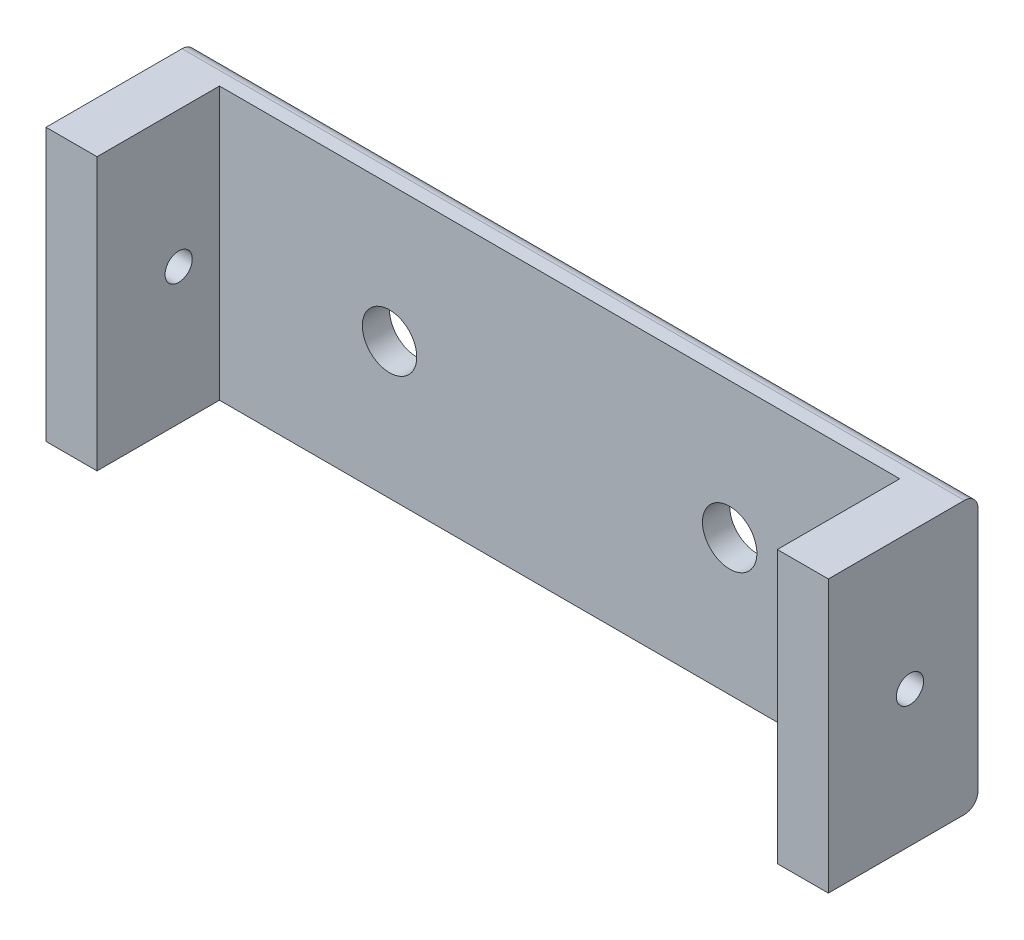
ISO-10303-21;
HEADER;
FILE_DESCRIPTION(('STEP AP214'),'2;1');
FILE_NAME('part.step','',(''),(''),'','','');
FILE_SCHEMA(('AUTOMOTIVE_DESIGN { 1 0 10303 214 1 1 1 1 }'));
ENDSEC;
DATA;
#1=APPLICATION_CONTEXT('core data for automotive mechanical design processes');
#2=APPLICATION_PROTOCOL_DEFINITION('international standard','automotive_design',2000,#1);
#3=PRODUCT_CONTEXT('',#1,'mechanical');
#4=PRODUCT('Part','Part','',(#3));
#5=PRODUCT_RELATED_PRODUCT_CATEGORY('part','',(#4));
#6=PRODUCT_DEFINITION_FORMATION('','',#4);
#7=PRODUCT_DEFINITION_CONTEXT('part definition',#1,'design');
#8=PRODUCT_DEFINITION('design','',#6,#7);
#9=PRODUCT_DEFINITION_SHAPE('','',#8);
#10=(LENGTH_UNIT() NAMED_UNIT(*) SI_UNIT(.MILLI.,.METRE.));
#11=(NAMED_UNIT(*) PLANE_ANGLE_UNIT() SI_UNIT($,.RADIAN.));
#12=(NAMED_UNIT(*) SI_UNIT($,.STERADIAN.) SOLID_ANGLE_UNIT());
#13=UNCERTAINTY_MEASURE_WITH_UNIT(LENGTH_MEASURE(1.E-05),#10,'distance_accuracy_value','');
#14=(GEOMETRIC_REPRESENTATION_CONTEXT(3) GLOBAL_UNCERTAINTY_ASSIGNED_CONTEXT((#13)) GLOBAL_UNIT_ASSIGNED_CONTEXT((#10,
#11,#12)) REPRESENTATION_CONTEXT('',''));
#15=CARTESIAN_POINT('',(0.,0.,0.));
#16=DIRECTION('',(0.,0.,1.));
#17=DIRECTION('',(1.,0.,0.));
#18=AXIS2_PLACEMENT_3D('',#15,#16,#17);
#19=CARTESIAN_POINT('',(57.5,-20.,25.));
#20=DIRECTION('',(-1.,0.,0.));
#21=DIRECTION('',(0.,0.,1.));
#22=AXIS2_PLACEMENT_3D('',#19,#20,#21);
#23=PLANE('',#22);
#24=CARTESIAN_POINT('',(57.5,-8.10915094297487E-13,10.));
#25=DIRECTION('',(-1.,0.,0.));
#26=DIRECTION('',(0.,0.,1.));
#27=AXIS2_PLACEMENT_3D('',#24,#25,#26);
#28=CIRCLE('',#27,2.);
#29=CARTESIAN_POINT('',(57.5,-8.10915094297487E-13,12.));
#30=VERTEX_POINT('',#29);
#31=EDGE_CURVE('E206',#30,#30,#28,.T.);
#32=ORIENTED_EDGE('',*,*,#31,.T.);
#33=EDGE_LOOP('',(#32));
#34=FACE_BOUND('',#33,.T.);
#35=DIRECTION('',(0.,1.,0.));
#36=VECTOR('',#35,1.);
#37=CARTESIAN_POINT('',(57.5,20.,22.));
#38=LINE('',#37,#36);
#39=CARTESIAN_POINT('',(57.5,-20.,22.));
#40=VERTEX_POINT('',#39);
#41=CARTESIAN_POINT('',(57.5,20.,22.));
#42=VERTEX_POINT('',#41);
#43=EDGE_CURVE('E133',#40,#42,#38,.T.);
#44=ORIENTED_EDGE('',*,*,#43,.F.);
#45=DIRECTION('',(0.,0.,-1.));
#46=VECTOR('',#45,1.);
#47=CARTESIAN_POINT('',(57.5,-20.,25.));
#48=LINE('',#47,#46);
#49=CARTESIAN_POINT('',(57.5,-20.,2.));
#50=VERTEX_POINT('',#49);
#51=EDGE_CURVE('E136',#40,#50,#48,.T.);
#52=ORIENTED_EDGE('',*,*,#51,.T.);
#53=CARTESIAN_POINT('',(57.5,-18.,2.));
#54=DIRECTION('',(-1.,0.,0.));
#55=DIRECTION('',(0.,0.,1.));
#56=AXIS2_PLACEMENT_3D('',#53,#54,#55);
#57=CIRCLE('',#56,2.);
#58=CARTESIAN_POINT('',(57.5,-18.,0.));
#59=VERTEX_POINT('',#58);
#60=EDGE_CURVE('E170',#50,#59,#57,.F.);
#61=ORIENTED_EDGE('',*,*,#60,.T.);
#62=DIRECTION('',(0.,1.,0.));
#63=VECTOR('',#62,1.);
#64=CARTESIAN_POINT('',(57.5,-20.,0.));
#65=LINE('',#64,#63);
#66=CARTESIAN_POINT('',(57.5,18.,0.));
#67=VERTEX_POINT('',#66);
#68=EDGE_CURVE('E176',#59,#67,#65,.T.);
#69=ORIENTED_EDGE('',*,*,#68,.T.);
#70=CARTESIAN_POINT('',(57.5,18.,2.));
#71=DIRECTION('',(-1.,0.,0.));
#72=DIRECTION('',(0.,0.,1.));
#73=AXIS2_PLACEMENT_3D('',#70,#71,#72);
#74=CIRCLE('',#73,2.);
#75=CARTESIAN_POINT('',(57.5,20.,2.));
#76=VERTEX_POINT('',#75);
#77=EDGE_CURVE('E162',#67,#76,#74,.F.);
#78=ORIENTED_EDGE('',*,*,#77,.T.);
#79=DIRECTION('',(0.,0.,-1.));
#80=VECTOR('',#79,1.);
#81=CARTESIAN_POINT('',(57.5,20.,25.));
#82=LINE('',#81,#80);
#83=EDGE_CURVE('E145',#42,#76,#82,.T.);
#84=ORIENTED_EDGE('',*,*,#83,.F.);
#85=EDGE_LOOP('',(#44,#52,#61,#69,#78,#84));
#86=FACE_BOUND('',#85,.T.);
#87=ADVANCED_FACE('F41',(#34,#86),#23,.F.);
#88=CARTESIAN_POINT('',(-57.5,-20.,25.));
#89=DIRECTION('',(1.,0.,0.));
#90=DIRECTION('',(0.,0.,-1.));
#91=AXIS2_PLACEMENT_3D('',#88,#89,#90);
#92=PLANE('',#91);
#93=CARTESIAN_POINT('',(-57.5000000000001,0.,10.));
#94=DIRECTION('',(-1.,0.,0.));
#95=DIRECTION('',(0.,-1.,0.));
#96=AXIS2_PLACEMENT_3D('',#93,#94,#95);
#97=CIRCLE('',#96,2.);
#98=CARTESIAN_POINT('',(-57.5000000000001,-2.00000000000001,10.));
#99=VERTEX_POINT('',#98);
#100=EDGE_CURVE('E154',#99,#99,#97,.T.);
#101=ORIENTED_EDGE('',*,*,#100,.F.);
#102=EDGE_LOOP('',(#101));
#103=FACE_BOUND('',#102,.T.);
#104=DIRECTION('',(0.,-1.,0.));
#105=VECTOR('',#104,1.);
#106=CARTESIAN_POINT('',(-57.5,20.,22.));
#107=LINE('',#106,#105);
#108=CARTESIAN_POINT('',(-57.5,20.,22.));
#109=VERTEX_POINT('',#108);
#110=CARTESIAN_POINT('',(-57.5,-20.,22.));
#111=VERTEX_POINT('',#110);
#112=EDGE_CURVE('E114',#109,#111,#107,.T.);
#113=ORIENTED_EDGE('',*,*,#112,.F.);
#114=DIRECTION('',(0.,0.,-1.));
#115=VECTOR('',#114,1.);
#116=CARTESIAN_POINT('',(-57.5,20.,25.));
#117=LINE('',#116,#115);
#118=CARTESIAN_POINT('',(-57.5,20.,2.));
#119=VERTEX_POINT('',#118);
#120=EDGE_CURVE('E139',#109,#119,#117,.T.);
#121=ORIENTED_EDGE('',*,*,#120,.T.);
#122=CARTESIAN_POINT('',(-57.5,18.,2.));
#123=DIRECTION('',(1.,0.,0.));
#124=DIRECTION('',(0.,0.,-1.));
#125=AXIS2_PLACEMENT_3D('',#122,#123,#124);
#126=CIRCLE('',#125,2.);
#127=CARTESIAN_POINT('',(-57.5,18.,0.));
#128=VERTEX_POINT('',#127);
#129=EDGE_CURVE('E160',#119,#128,#126,.F.);
#130=ORIENTED_EDGE('',*,*,#129,.T.);
#131=DIRECTION('',(0.,-1.,0.));
#132=VECTOR('',#131,1.);
#133=CARTESIAN_POINT('',(-57.5,-20.,0.));
#134=LINE('',#133,#132);
#135=CARTESIAN_POINT('',(-57.5,-18.,0.));
#136=VERTEX_POINT('',#135);
#137=EDGE_CURVE('E144',#128,#136,#134,.T.);
#138=ORIENTED_EDGE('',*,*,#137,.T.);
#139=CARTESIAN_POINT('',(-57.5,-18.,2.));
#140=DIRECTION('',(1.,0.,0.));
#141=DIRECTION('',(0.,0.,-1.));
#142=AXIS2_PLACEMENT_3D('',#139,#140,#141);
#143=CIRCLE('',#142,2.);
#144=CARTESIAN_POINT('',(-57.5,-20.,2.));
#145=VERTEX_POINT('',#144);
#146=EDGE_CURVE('E47',#136,#145,#143,.F.);
#147=ORIENTED_EDGE('',*,*,#146,.T.);
#148=DIRECTION('',(0.,0.,-1.));
#149=VECTOR('',#148,1.);
#150=CARTESIAN_POINT('',(-57.5,-20.,25.));
#151=LINE('',#150,#149);
#152=EDGE_CURVE('E129',#111,#145,#151,.T.);
#153=ORIENTED_EDGE('',*,*,#152,.F.);
#154=EDGE_LOOP('',(#113,#121,#130,#138,#147,#153));
#155=FACE_BOUND('',#154,.T.);
#156=ADVANCED_FACE('F131',(#103,#155),#92,.F.);
#157=CARTESIAN_POINT('',(-57.5,20.,25.));
#158=DIRECTION('',(0.,-1.,0.));
#159=DIRECTION('',(0.,0.,-1.));
#160=AXIS2_PLACEMENT_3D('',#157,#158,#159);
#161=PLANE('',#160);
#162=DIRECTION('',(-1.,0.,0.));
#163=VECTOR('',#162,1.);
#164=CARTESIAN_POINT('',(-57.5,20.,22.));
#165=LINE('',#164,#163);
#166=CARTESIAN_POINT('',(50.,20.,22.));
#167=VERTEX_POINT('',#166);
#168=EDGE_CURVE('E57',#42,#167,#165,.T.);
#169=ORIENTED_EDGE('',*,*,#168,.F.);
#170=ORIENTED_EDGE('',*,*,#83,.T.);
#171=DIRECTION('',(-1.,0.,0.));
#172=VECTOR('',#171,1.);
#173=CARTESIAN_POINT('',(-57.5,20.,2.));
#174=LINE('',#173,#172);
#175=EDGE_CURVE('E146',#76,#119,#174,.T.);
#176=ORIENTED_EDGE('',*,*,#175,.T.);
#177=ORIENTED_EDGE('',*,*,#120,.F.);
#178=CARTESIAN_POINT('',(-50.,20.,22.));
#179=VERTEX_POINT('',#178);
#180=EDGE_CURVE('E117',#179,#109,#165,.T.);
#181=ORIENTED_EDGE('',*,*,#180,.F.);
#182=DIRECTION('',(0.,0.,1.));
#183=VECTOR('',#182,1.);
#184=CARTESIAN_POINT('',(-50.,20.,3.99999999999997));
#185=LINE('',#184,#183);
#186=CARTESIAN_POINT('',(-50.,20.,3.99999999999997));
#187=VERTEX_POINT('',#186);
#188=EDGE_CURVE('E228',#187,#179,#185,.T.);
#189=ORIENTED_EDGE('',*,*,#188,.F.);
#190=DIRECTION('',(-1.,0.,0.));
#191=VECTOR('',#190,1.);
#192=CARTESIAN_POINT('',(-50.,20.,3.99999999999997));
#193=LINE('',#192,#191);
#194=CARTESIAN_POINT('',(50.,20.,3.99999999999997));
#195=VERTEX_POINT('',#194);
#196=EDGE_CURVE('E211',#195,#187,#193,.T.);
#197=ORIENTED_EDGE('',*,*,#196,.F.);
#198=DIRECTION('',(0.,0.,1.));
#199=VECTOR('',#198,1.);
#200=CARTESIAN_POINT('',(50.,20.,3.99999999999997));
#201=LINE('',#200,#199);
#202=EDGE_CURVE('E225',#195,#167,#201,.T.);
#203=ORIENTED_EDGE('',*,*,#202,.T.);
#204=EDGE_LOOP('',(#169,#170,#176,#177,#181,#189,#197,#203));
#205=FACE_BOUND('',#204,.T.);
#206=ADVANCED_FACE('F236',(#205),#161,.F.);
#207=CARTESIAN_POINT('',(-57.5,-20.,25.));
#208=DIRECTION('',(0.,1.,0.));
#209=DIRECTION('',(0.,0.,1.));
#210=AXIS2_PLACEMENT_3D('',#207,#208,#209);
#211=PLANE('',#210);
#212=DIRECTION('',(1.,0.,0.));
#213=VECTOR('',#212,1.);
#214=CARTESIAN_POINT('',(-57.5,-20.,22.));
#215=LINE('',#214,#213);
#216=CARTESIAN_POINT('',(-50.,-20.,22.));
#217=VERTEX_POINT('',#216);
#218=EDGE_CURVE('E64',#111,#217,#215,.T.);
#219=ORIENTED_EDGE('',*,*,#218,.F.);
#220=ORIENTED_EDGE('',*,*,#152,.T.);
#221=DIRECTION('',(1.,0.,0.));
#222=VECTOR('',#221,1.);
#223=CARTESIAN_POINT('',(57.5,-20.,2.));
#224=LINE('',#223,#222);
#225=EDGE_CURVE('E164',#145,#50,#224,.T.);
#226=ORIENTED_EDGE('',*,*,#225,.T.);
#227=ORIENTED_EDGE('',*,*,#51,.F.);
#228=CARTESIAN_POINT('',(50.,-20.,22.));
#229=VERTEX_POINT('',#228);
#230=EDGE_CURVE('E125',#229,#40,#215,.T.);
#231=ORIENTED_EDGE('',*,*,#230,.F.);
#232=DIRECTION('',(0.,0.,1.));
#233=VECTOR('',#232,1.);
#234=CARTESIAN_POINT('',(50.,-20.,3.99999999999997));
#235=LINE('',#234,#233);
#236=CARTESIAN_POINT('',(50.,-20.,3.99999999999997));
#237=VERTEX_POINT('',#236);
#238=EDGE_CURVE('E223',#237,#229,#235,.T.);
#239=ORIENTED_EDGE('',*,*,#238,.F.);
#240=DIRECTION('',(1.,0.,0.));
#241=VECTOR('',#240,1.);
#242=CARTESIAN_POINT('',(-50.,-20.,3.99999999999997));
#243=LINE('',#242,#241);
#244=CARTESIAN_POINT('',(-50.,-20.,3.99999999999997));
#245=VERTEX_POINT('',#244);
#246=EDGE_CURVE('E219',#245,#237,#243,.T.);
#247=ORIENTED_EDGE('',*,*,#246,.F.);
#248=DIRECTION('',(0.,0.,1.));
#249=VECTOR('',#248,1.);
#250=CARTESIAN_POINT('',(-50.,-20.,3.99999999999997));
#251=LINE('',#250,#249);
#252=EDGE_CURVE('E135',#245,#217,#251,.T.);
#253=ORIENTED_EDGE('',*,*,#252,.T.);
#254=EDGE_LOOP('',(#219,#220,#226,#227,#231,#239,#247,#253));
#255=FACE_BOUND('',#254,.T.);
#256=ADVANCED_FACE('F127',(#255),#211,.F.);
#257=CARTESIAN_POINT('',(50.,-20.,3.99999999999997));
#258=DIRECTION('',(1.,0.,0.));
#259=DIRECTION('',(0.,0.,-1.));
#260=AXIS2_PLACEMENT_3D('',#257,#258,#259);
#261=PLANE('',#260);
#262=CARTESIAN_POINT('',(50.,-7.5854287421484E-13,10.));
#263=DIRECTION('',(1.,0.,0.));
#264=DIRECTION('',(0.,0.,-1.));
#265=AXIS2_PLACEMENT_3D('',#262,#263,#264);
#266=CIRCLE('',#265,2.);
#267=CARTESIAN_POINT('',(50.,-7.5854287421484E-13,8.));
#268=VERTEX_POINT('',#267);
#269=EDGE_CURVE('E153',#268,#268,#266,.T.);
#270=ORIENTED_EDGE('',*,*,#269,.T.);
#271=EDGE_LOOP('',(#270));
#272=FACE_BOUND('',#271,.T.);
#273=DIRECTION('',(0.,-1.,0.));
#274=VECTOR('',#273,1.);
#275=CARTESIAN_POINT('',(50.,-20.,22.));
#276=LINE('',#275,#274);
#277=EDGE_CURVE('E188',#167,#229,#276,.T.);
#278=ORIENTED_EDGE('',*,*,#277,.F.);
#279=ORIENTED_EDGE('',*,*,#202,.F.);
#280=DIRECTION('',(0.,1.,0.));
#281=VECTOR('',#280,1.);
#282=CARTESIAN_POINT('',(50.,-20.,3.99999999999997));
#283=LINE('',#282,#281);
#284=EDGE_CURVE('E212',#237,#195,#283,.T.);
#285=ORIENTED_EDGE('',*,*,#284,.F.);
#286=ORIENTED_EDGE('',*,*,#238,.T.);
#287=EDGE_LOOP('',(#278,#279,#285,#286));
#288=FACE_BOUND('',#287,.T.);
#289=ADVANCED_FACE('F239',(#272,#288),#261,.F.);
#290=CARTESIAN_POINT('',(-50.,-20.,3.99999999999997));
#291=DIRECTION('',(-1.,0.,0.));
#292=DIRECTION('',(0.,0.,1.));
#293=AXIS2_PLACEMENT_3D('',#290,#291,#292);
#294=PLANE('',#293);
#295=CARTESIAN_POINT('',(-50.,0.,10.));
#296=DIRECTION('',(-1.,0.,0.));
#297=DIRECTION('',(0.,0.,1.));
#298=AXIS2_PLACEMENT_3D('',#295,#296,#297);
#299=CIRCLE('',#298,2.);
#300=CARTESIAN_POINT('',(-50.,0.,12.));
#301=VERTEX_POINT('',#300);
#302=EDGE_CURVE('E148',#301,#301,#299,.T.);
#303=ORIENTED_EDGE('',*,*,#302,.T.);
#304=EDGE_LOOP('',(#303));
#305=FACE_BOUND('',#304,.T.);
#306=DIRECTION('',(0.,1.,0.));
#307=VECTOR('',#306,1.);
#308=CARTESIAN_POINT('',(-50.,-20.,22.));
#309=LINE('',#308,#307);
#310=EDGE_CURVE('E11',#217,#179,#309,.T.);
#311=ORIENTED_EDGE('',*,*,#310,.F.);
#312=ORIENTED_EDGE('',*,*,#252,.F.);
#313=DIRECTION('',(0.,-1.,0.));
#314=VECTOR('',#313,1.);
#315=CARTESIAN_POINT('',(-50.,-20.,3.99999999999997));
#316=LINE('',#315,#314);
#317=EDGE_CURVE('E220',#187,#245,#316,.T.);
#318=ORIENTED_EDGE('',*,*,#317,.F.);
#319=ORIENTED_EDGE('',*,*,#188,.T.);
#320=EDGE_LOOP('',(#311,#312,#318,#319));
#321=FACE_BOUND('',#320,.T.);
#322=ADVANCED_FACE('F242',(#305,#321),#294,.F.);
#323=CARTESIAN_POINT('',(0.,0.,0.));
#324=DIRECTION('',(0.,0.,-1.));
#325=DIRECTION('',(-1.,0.,0.));
#326=AXIS2_PLACEMENT_3D('',#323,#324,#325);
#327=PLANE('',#326);
#328=CARTESIAN_POINT('',(-25.,0.,0.));
#329=DIRECTION('',(0.,0.,-1.));
#330=DIRECTION('',(-1.,0.,0.));
#331=AXIS2_PLACEMENT_3D('',#328,#329,#330);
#332=CIRCLE('',#331,4.);
#333=CARTESIAN_POINT('',(-29.,0.,0.));
#334=VERTEX_POINT('',#333);
#335=EDGE_CURVE('E202',#334,#334,#332,.T.);
#336=ORIENTED_EDGE('',*,*,#335,.F.);
#337=EDGE_LOOP('',(#336));
#338=FACE_BOUND('',#337,.T.);
#339=CARTESIAN_POINT('',(25.,0.,0.));
#340=DIRECTION('',(0.,0.,-1.));
#341=DIRECTION('',(-1.,0.,0.));
#342=AXIS2_PLACEMENT_3D('',#339,#340,#341);
#343=CIRCLE('',#342,4.);
#344=CARTESIAN_POINT('',(21.,0.,0.));
#345=VERTEX_POINT('',#344);
#346=EDGE_CURVE('E197',#345,#345,#343,.T.);
#347=ORIENTED_EDGE('',*,*,#346,.F.);
#348=EDGE_LOOP('',(#347));
#349=FACE_BOUND('',#348,.T.);
#350=ORIENTED_EDGE('',*,*,#68,.F.);
#351=DIRECTION('',(1.,0.,0.));
#352=VECTOR('',#351,1.);
#353=CARTESIAN_POINT('',(-57.5,-18.,0.));
#354=LINE('',#353,#352);
#355=EDGE_CURVE('E169',#59,#136,#354,.F.);
#356=ORIENTED_EDGE('',*,*,#355,.T.);
#357=ORIENTED_EDGE('',*,*,#137,.F.);
#358=DIRECTION('',(-1.,0.,0.));
#359=VECTOR('',#358,1.);
#360=CARTESIAN_POINT('',(57.5,18.,0.));
#361=LINE('',#360,#359);
#362=EDGE_CURVE('E159',#128,#67,#361,.F.);
#363=ORIENTED_EDGE('',*,*,#362,.T.);
#364=EDGE_LOOP('',(#350,#356,#357,#363));
#365=FACE_BOUND('',#364,.T.);
#366=ADVANCED_FACE('F172',(#338,#349,#365),#327,.T.);
#367=CARTESIAN_POINT('',(0.,0.,3.99999999999997));
#368=DIRECTION('',(0.,0.,-1.));
#369=DIRECTION('',(-1.,0.,0.));
#370=AXIS2_PLACEMENT_3D('',#367,#368,#369);
#371=PLANE('',#370);
#372=CARTESIAN_POINT('',(-25.,0.,4.00000000000008));
#373=DIRECTION('',(0.,0.,1.));
#374=DIRECTION('',(1.,0.,0.));
#375=AXIS2_PLACEMENT_3D('',#372,#373,#374);
#376=CIRCLE('',#375,4.);
#377=CARTESIAN_POINT('',(-21.,0.,4.00000000000008));
#378=VERTEX_POINT('',#377);
#379=EDGE_CURVE('E194',#378,#378,#376,.T.);
#380=ORIENTED_EDGE('',*,*,#379,.F.);
#381=EDGE_LOOP('',(#380));
#382=FACE_BOUND('',#381,.T.);
#383=CARTESIAN_POINT('',(25.,0.,4.00000000000008));
#384=DIRECTION('',(0.,0.,1.));
#385=DIRECTION('',(-1.,0.,0.));
#386=AXIS2_PLACEMENT_3D('',#383,#384,#385);
#387=CIRCLE('',#386,4.);
#388=CARTESIAN_POINT('',(21.,0.,4.00000000000008));
#389=VERTEX_POINT('',#388);
#390=EDGE_CURVE('E195',#389,#389,#387,.T.);
#391=ORIENTED_EDGE('',*,*,#390,.F.);
#392=EDGE_LOOP('',(#391));
#393=FACE_BOUND('',#392,.T.);
#394=ORIENTED_EDGE('',*,*,#284,.T.);
#395=ORIENTED_EDGE('',*,*,#196,.T.);
#396=ORIENTED_EDGE('',*,*,#317,.T.);
#397=ORIENTED_EDGE('',*,*,#246,.T.);
#398=EDGE_LOOP('',(#394,#395,#396,#397));
#399=FACE_BOUND('',#398,.T.);
#400=ADVANCED_FACE('F245',(#382,#393,#399),#371,.F.);
#401=CARTESIAN_POINT('',(80.5,-9.71523235884271E-13,10.));
#402=DIRECTION('',(-1.,0.,0.));
#403=DIRECTION('',(0.,-1.,0.));
#404=AXIS2_PLACEMENT_3D('',#401,#402,#403);
#405=CYLINDRICAL_SURFACE('',#404,2.);
#406=ORIENTED_EDGE('',*,*,#100,.T.);
#407=EDGE_LOOP('',(#406));
#408=FACE_BOUND('',#407,.T.);
#409=ORIENTED_EDGE('',*,*,#302,.F.);
#410=EDGE_LOOP('',(#409));
#411=FACE_BOUND('',#410,.T.);
#412=ADVANCED_FACE('F273',(#408,#411),#405,.F.);
#413=ORIENTED_EDGE('',*,*,#269,.F.);
#414=EDGE_LOOP('',(#413));
#415=FACE_BOUND('',#414,.T.);
#416=ORIENTED_EDGE('',*,*,#31,.F.);
#417=EDGE_LOOP('',(#416));
#418=FACE_BOUND('',#417,.T.);
#419=ADVANCED_FACE('F269',(#415,#418),#405,.F.);
#420=CARTESIAN_POINT('',(-57.5,18.,2.));
#421=DIRECTION('',(1.,0.,0.));
#422=DIRECTION('',(0.,0.,-1.));
#423=AXIS2_PLACEMENT_3D('',#420,#421,#422);
#424=CYLINDRICAL_SURFACE('',#423,2.);
#425=ORIENTED_EDGE('',*,*,#77,.F.);
#426=ORIENTED_EDGE('',*,*,#362,.F.);
#427=ORIENTED_EDGE('',*,*,#129,.F.);
#428=ORIENTED_EDGE('',*,*,#175,.F.);
#429=EDGE_LOOP('',(#425,#426,#427,#428));
#430=FACE_BOUND('',#429,.T.);
#431=ADVANCED_FACE('F234',(#430),#424,.T.);
#432=CARTESIAN_POINT('',(-57.5,-18.,2.));
#433=DIRECTION('',(-1.,0.,0.));
#434=DIRECTION('',(0.,0.,1.));
#435=AXIS2_PLACEMENT_3D('',#432,#433,#434);
#436=CYLINDRICAL_SURFACE('',#435,2.);
#437=ORIENTED_EDGE('',*,*,#146,.F.);
#438=ORIENTED_EDGE('',*,*,#355,.F.);
#439=ORIENTED_EDGE('',*,*,#60,.F.);
#440=ORIENTED_EDGE('',*,*,#225,.F.);
#441=EDGE_LOOP('',(#437,#438,#439,#440));
#442=FACE_BOUND('',#441,.T.);
#443=ADVANCED_FACE('F43',(#442),#436,.T.);
#444=CARTESIAN_POINT('',(25.,0.,-4.99999999999994));
#445=DIRECTION('',(0.,0.,1.));
#446=DIRECTION('',(1.,0.,0.));
#447=AXIS2_PLACEMENT_3D('',#444,#445,#446);
#448=CYLINDRICAL_SURFACE('',#447,4.);
#449=ORIENTED_EDGE('',*,*,#346,.T.);
#450=EDGE_LOOP('',(#449));
#451=FACE_BOUND('',#450,.T.);
#452=ORIENTED_EDGE('',*,*,#390,.T.);
#453=EDGE_LOOP('',(#452));
#454=FACE_BOUND('',#453,.T.);
#455=ADVANCED_FACE('F274',(#451,#454),#448,.F.);
#456=CARTESIAN_POINT('',(-25.,0.,-4.99999999999994));
#457=DIRECTION('',(0.,0.,1.));
#458=DIRECTION('',(1.,0.,0.));
#459=AXIS2_PLACEMENT_3D('',#456,#457,#458);
#460=CYLINDRICAL_SURFACE('',#459,4.);
#461=ORIENTED_EDGE('',*,*,#335,.T.);
#462=EDGE_LOOP('',(#461));
#463=FACE_BOUND('',#462,.T.);
#464=ORIENTED_EDGE('',*,*,#379,.T.);
#465=EDGE_LOOP('',(#464));
#466=FACE_BOUND('',#465,.T.);
#467=ADVANCED_FACE('F294',(#463,#466),#460,.F.);
#468=CARTESIAN_POINT('',(0.,0.,22.));
#469=DIRECTION('',(0.,0.,1.));
#470=DIRECTION('',(1.,0.,0.));
#471=AXIS2_PLACEMENT_3D('',#468,#469,#470);
#472=PLANE('',#471);
#473=ORIENTED_EDGE('',*,*,#310,.T.);
#474=ORIENTED_EDGE('',*,*,#180,.T.);
#475=ORIENTED_EDGE('',*,*,#112,.T.);
#476=ORIENTED_EDGE('',*,*,#218,.T.);
#477=EDGE_LOOP('',(#473,#474,#475,#476));
#478=FACE_BOUND('',#477,.T.);
#479=ADVANCED_FACE('F116',(#478),#472,.T.);
#480=ORIENTED_EDGE('',*,*,#277,.T.);
#481=ORIENTED_EDGE('',*,*,#230,.T.);
#482=ORIENTED_EDGE('',*,*,#43,.T.);
#483=ORIENTED_EDGE('',*,*,#168,.T.);
#484=EDGE_LOOP('',(#480,#481,#482,#483));
#485=FACE_BOUND('',#484,.T.);
#486=ADVANCED_FACE('F302',(#485),#472,.T.);
#487=CLOSED_SHELL('',(#87,#156,#206,#256,#289,#322,#366,#400,#412,#419,#431,#443,#455,#467,#479,#486));
#488=MANIFOLD_SOLID_BREP('B2',#487);
#489=ADVANCED_BREP_SHAPE_REPRESENTATION('',(#18,#488),#14);
#490=SHAPE_DEFINITION_REPRESENTATION(#9,#489);
ENDSEC;
END-ISO-10303-21;
